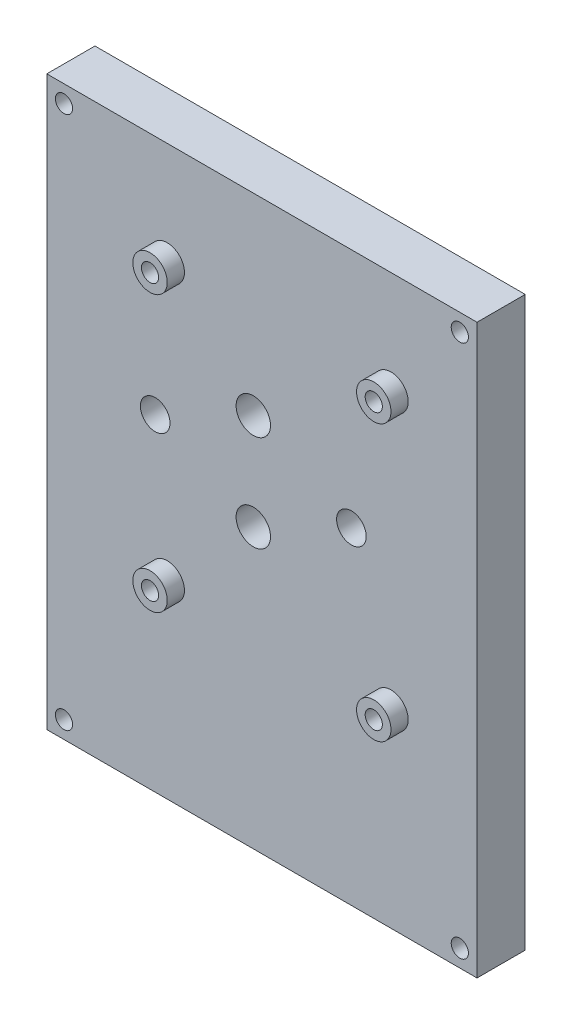
ISO-10303-21;
HEADER;
FILE_DESCRIPTION(('STEP AP214'),'2;1');
FILE_NAME('part.step','',(''),(''),'','','');
FILE_SCHEMA(('AUTOMOTIVE_DESIGN { 1 0 10303 214 1 1 1 1 }'));
ENDSEC;
DATA;
#1=APPLICATION_CONTEXT('core data for automotive mechanical design processes');
#2=APPLICATION_PROTOCOL_DEFINITION('international standard','automotive_design',2000,#1);
#3=PRODUCT_CONTEXT('',#1,'mechanical');
#4=PRODUCT('Part','Part','',(#3));
#5=PRODUCT_RELATED_PRODUCT_CATEGORY('part','',(#4));
#6=PRODUCT_DEFINITION_FORMATION('','',#4);
#7=PRODUCT_DEFINITION_CONTEXT('part definition',#1,'design');
#8=PRODUCT_DEFINITION('design','',#6,#7);
#9=PRODUCT_DEFINITION_SHAPE('','',#8);
#10=(LENGTH_UNIT() NAMED_UNIT(*) SI_UNIT(.MILLI.,.METRE.));
#11=(NAMED_UNIT(*) PLANE_ANGLE_UNIT() SI_UNIT($,.RADIAN.));
#12=(NAMED_UNIT(*) SI_UNIT($,.STERADIAN.) SOLID_ANGLE_UNIT());
#13=UNCERTAINTY_MEASURE_WITH_UNIT(LENGTH_MEASURE(1.E-05),#10,'distance_accuracy_value','');
#14=(GEOMETRIC_REPRESENTATION_CONTEXT(3) GLOBAL_UNCERTAINTY_ASSIGNED_CONTEXT((#13)) GLOBAL_UNIT_ASSIGNED_CONTEXT((#10,
#11,#12)) REPRESENTATION_CONTEXT('',''));
#15=CARTESIAN_POINT('',(0.,0.,0.));
#16=DIRECTION('',(0.,0.,1.));
#17=DIRECTION('',(1.,0.,0.));
#18=AXIS2_PLACEMENT_3D('',#15,#16,#17);
#19=CARTESIAN_POINT('',(0.,-7.,7.));
#20=DIRECTION('',(0.,0.,-1.));
#21=DIRECTION('',(-1.,0.,0.));
#22=AXIS2_PLACEMENT_3D('',#19,#20,#21);
#23=CYLINDRICAL_SURFACE('',#22,2.5);
#24=CARTESIAN_POINT('',(0.,-7.,7.));
#25=DIRECTION('',(0.,0.,1.));
#26=DIRECTION('',(1.,0.,0.));
#27=AXIS2_PLACEMENT_3D('',#24,#25,#26);
#28=CIRCLE('',#27,2.5);
#29=CARTESIAN_POINT('',(2.5,-7.,7.));
#30=VERTEX_POINT('',#29);
#31=EDGE_CURVE('E145',#30,#30,#28,.T.);
#32=ORIENTED_EDGE('',*,*,#31,.T.);
#33=EDGE_LOOP('',(#32));
#34=FACE_BOUND('',#33,.T.);
#35=CARTESIAN_POINT('',(0.,-7.,0.));
#36=DIRECTION('',(0.,0.,1.));
#37=DIRECTION('',(1.,0.,0.));
#38=AXIS2_PLACEMENT_3D('',#35,#36,#37);
#39=CIRCLE('',#38,2.5);
#40=CARTESIAN_POINT('',(2.5,-7.,0.));
#41=VERTEX_POINT('',#40);
#42=EDGE_CURVE('E272',#41,#41,#39,.T.);
#43=ORIENTED_EDGE('',*,*,#42,.F.);
#44=EDGE_LOOP('',(#43));
#45=FACE_BOUND('',#44,.T.);
#46=ADVANCED_FACE('F136',(#34,#45),#23,.F.);
#47=CARTESIAN_POINT('',(0.,7.,7.));
#48=DIRECTION('',(0.,0.,-1.));
#49=DIRECTION('',(-1.,0.,0.));
#50=AXIS2_PLACEMENT_3D('',#47,#48,#49);
#51=CYLINDRICAL_SURFACE('',#50,2.5);
#52=CARTESIAN_POINT('',(0.,7.,7.));
#53=DIRECTION('',(0.,0.,1.));
#54=DIRECTION('',(1.,0.,0.));
#55=AXIS2_PLACEMENT_3D('',#52,#53,#54);
#56=CIRCLE('',#55,2.5);
#57=CARTESIAN_POINT('',(2.5,7.,7.));
#58=VERTEX_POINT('',#57);
#59=EDGE_CURVE('E12',#58,#58,#56,.T.);
#60=ORIENTED_EDGE('',*,*,#59,.T.);
#61=EDGE_LOOP('',(#60));
#62=FACE_BOUND('',#61,.T.);
#63=CARTESIAN_POINT('',(0.,7.,0.));
#64=DIRECTION('',(0.,0.,1.));
#65=DIRECTION('',(1.,0.,0.));
#66=AXIS2_PLACEMENT_3D('',#63,#64,#65);
#67=CIRCLE('',#66,2.5);
#68=CARTESIAN_POINT('',(2.5,7.,0.));
#69=VERTEX_POINT('',#68);
#70=EDGE_CURVE('E139',#69,#69,#67,.T.);
#71=ORIENTED_EDGE('',*,*,#70,.F.);
#72=EDGE_LOOP('',(#71));
#73=FACE_BOUND('',#72,.T.);
#74=ADVANCED_FACE('F284',(#62,#73),#51,.F.);
#75=CARTESIAN_POINT('',(0.,0.,7.));
#76=DIRECTION('',(0.,0.,1.));
#77=DIRECTION('',(1.,0.,0.));
#78=AXIS2_PLACEMENT_3D('',#75,#76,#77);
#79=PLANE('',#78);
#80=CARTESIAN_POINT('',(-27.5,-45.,7.));
#81=DIRECTION('',(0.,0.,1.));
#82=DIRECTION('',(1.,0.,0.));
#83=AXIS2_PLACEMENT_3D('',#80,#81,#82);
#84=CIRCLE('',#83,1.25);
#85=CARTESIAN_POINT('',(-26.25,-45.,7.));
#86=VERTEX_POINT('',#85);
#87=EDGE_CURVE('E400',#86,#86,#84,.T.);
#88=ORIENTED_EDGE('',*,*,#87,.F.);
#89=EDGE_LOOP('',(#88));
#90=FACE_BOUND('',#89,.T.);
#91=CARTESIAN_POINT('',(30.,-45.,7.));
#92=DIRECTION('',(0.,0.,1.));
#93=DIRECTION('',(1.,0.,0.));
#94=AXIS2_PLACEMENT_3D('',#91,#92,#93);
#95=CIRCLE('',#94,1.25);
#96=CARTESIAN_POINT('',(31.25,-45.,7.));
#97=VERTEX_POINT('',#96);
#98=EDGE_CURVE('E394',#97,#97,#95,.T.);
#99=ORIENTED_EDGE('',*,*,#98,.F.);
#100=EDGE_LOOP('',(#99));
#101=FACE_BOUND('',#100,.T.);
#102=CARTESIAN_POINT('',(30.,32.5,7.));
#103=DIRECTION('',(0.,0.,1.));
#104=DIRECTION('',(1.,0.,0.));
#105=AXIS2_PLACEMENT_3D('',#102,#103,#104);
#106=CIRCLE('',#105,1.25);
#107=CARTESIAN_POINT('',(31.25,32.5,7.));
#108=VERTEX_POINT('',#107);
#109=EDGE_CURVE('E389',#108,#108,#106,.T.);
#110=ORIENTED_EDGE('',*,*,#109,.F.);
#111=EDGE_LOOP('',(#110));
#112=FACE_BOUND('',#111,.T.);
#113=CARTESIAN_POINT('',(-27.5,32.5,7.));
#114=DIRECTION('',(0.,0.,1.));
#115=DIRECTION('',(1.,0.,0.));
#116=AXIS2_PLACEMENT_3D('',#113,#114,#115);
#117=CIRCLE('',#116,1.25);
#118=CARTESIAN_POINT('',(-26.25,32.5,7.));
#119=VERTEX_POINT('',#118);
#120=EDGE_CURVE('E200',#119,#119,#117,.T.);
#121=ORIENTED_EDGE('',*,*,#120,.F.);
#122=EDGE_LOOP('',(#121));
#123=FACE_BOUND('',#122,.T.);
#124=CARTESIAN_POINT('',(-14.25,0.,7.));
#125=DIRECTION('',(0.,0.,1.));
#126=DIRECTION('',(1.,0.,0.));
#127=AXIS2_PLACEMENT_3D('',#124,#125,#126);
#128=CIRCLE('',#127,2.15);
#129=CARTESIAN_POINT('',(-12.1,0.,7.));
#130=VERTEX_POINT('',#129);
#131=EDGE_CURVE('E213',#130,#130,#128,.T.);
#132=ORIENTED_EDGE('',*,*,#131,.F.);
#133=EDGE_LOOP('',(#132));
#134=FACE_BOUND('',#133,.T.);
#135=CARTESIAN_POINT('',(14.25,0.,7.));
#136=DIRECTION('',(0.,0.,1.));
#137=DIRECTION('',(1.,0.,0.));
#138=AXIS2_PLACEMENT_3D('',#135,#136,#137);
#139=CIRCLE('',#138,2.15);
#140=CARTESIAN_POINT('',(16.4,0.,7.));
#141=VERTEX_POINT('',#140);
#142=EDGE_CURVE('E217',#141,#141,#139,.T.);
#143=ORIENTED_EDGE('',*,*,#142,.F.);
#144=EDGE_LOOP('',(#143));
#145=FACE_BOUND('',#144,.T.);
#146=CARTESIAN_POINT('',(20.,-20.,7.));
#147=DIRECTION('',(0.,0.,1.));
#148=DIRECTION('',(1.,0.,0.));
#149=AXIS2_PLACEMENT_3D('',#146,#147,#148);
#150=CIRCLE('',#149,2.5);
#151=CARTESIAN_POINT('',(22.5,-20.,7.));
#152=VERTEX_POINT('',#151);
#153=EDGE_CURVE('E239',#152,#152,#150,.T.);
#154=ORIENTED_EDGE('',*,*,#153,.F.);
#155=EDGE_LOOP('',(#154));
#156=FACE_BOUND('',#155,.T.);
#157=CARTESIAN_POINT('',(-12.5,-20.,7.));
#158=DIRECTION('',(0.,0.,1.));
#159=DIRECTION('',(1.,0.,0.));
#160=AXIS2_PLACEMENT_3D('',#157,#158,#159);
#161=CIRCLE('',#160,2.5);
#162=CARTESIAN_POINT('',(-10.,-20.,7.));
#163=VERTEX_POINT('',#162);
#164=EDGE_CURVE('E248',#163,#163,#161,.T.);
#165=ORIENTED_EDGE('',*,*,#164,.F.);
#166=EDGE_LOOP('',(#165));
#167=FACE_BOUND('',#166,.T.);
#168=CARTESIAN_POINT('',(20.,20.,7.));
#169=DIRECTION('',(0.,0.,1.));
#170=DIRECTION('',(1.,0.,0.));
#171=AXIS2_PLACEMENT_3D('',#168,#169,#170);
#172=CIRCLE('',#171,2.5);
#173=CARTESIAN_POINT('',(22.5,20.,7.));
#174=VERTEX_POINT('',#173);
#175=EDGE_CURVE('E257',#174,#174,#172,.T.);
#176=ORIENTED_EDGE('',*,*,#175,.F.);
#177=EDGE_LOOP('',(#176));
#178=FACE_BOUND('',#177,.T.);
#179=CARTESIAN_POINT('',(-12.5,20.,7.));
#180=DIRECTION('',(0.,0.,1.));
#181=DIRECTION('',(1.,0.,0.));
#182=AXIS2_PLACEMENT_3D('',#179,#180,#181);
#183=CIRCLE('',#182,2.5);
#184=CARTESIAN_POINT('',(-10.,20.,7.));
#185=VERTEX_POINT('',#184);
#186=EDGE_CURVE('E260',#185,#185,#183,.T.);
#187=ORIENTED_EDGE('',*,*,#186,.F.);
#188=EDGE_LOOP('',(#187));
#189=FACE_BOUND('',#188,.T.);
#190=ORIENTED_EDGE('',*,*,#31,.F.);
#191=EDGE_LOOP('',(#190));
#192=FACE_BOUND('',#191,.T.);
#193=ORIENTED_EDGE('',*,*,#59,.F.);
#194=EDGE_LOOP('',(#193));
#195=FACE_BOUND('',#194,.T.);
#196=DIRECTION('',(0.,-1.,0.));
#197=VECTOR('',#196,1.);
#198=CARTESIAN_POINT('',(-30.,-47.5,7.));
#199=LINE('',#198,#197);
#200=CARTESIAN_POINT('',(-30.,35.,7.));
#201=VERTEX_POINT('',#200);
#202=CARTESIAN_POINT('',(-30.,-47.5,7.));
#203=VERTEX_POINT('',#202);
#204=EDGE_CURVE('E179',#201,#203,#199,.T.);
#205=ORIENTED_EDGE('',*,*,#204,.T.);
#206=DIRECTION('',(1.,0.,0.));
#207=VECTOR('',#206,1.);
#208=CARTESIAN_POINT('',(-30.,-47.5,7.));
#209=LINE('',#208,#207);
#210=CARTESIAN_POINT('',(32.5,-47.5,7.));
#211=VERTEX_POINT('',#210);
#212=EDGE_CURVE('E187',#203,#211,#209,.T.);
#213=ORIENTED_EDGE('',*,*,#212,.T.);
#214=DIRECTION('',(0.,1.,0.));
#215=VECTOR('',#214,1.);
#216=CARTESIAN_POINT('',(32.5,-47.5,7.));
#217=LINE('',#216,#215);
#218=CARTESIAN_POINT('',(32.5,35.,7.));
#219=VERTEX_POINT('',#218);
#220=EDGE_CURVE('E193',#211,#219,#217,.T.);
#221=ORIENTED_EDGE('',*,*,#220,.T.);
#222=DIRECTION('',(-1.,0.,0.));
#223=VECTOR('',#222,1.);
#224=CARTESIAN_POINT('',(-30.,35.,7.));
#225=LINE('',#224,#223);
#226=EDGE_CURVE('E184',#219,#201,#225,.T.);
#227=ORIENTED_EDGE('',*,*,#226,.T.);
#228=EDGE_LOOP('',(#205,#213,#221,#227));
#229=FACE_BOUND('',#228,.T.);
#230=ADVANCED_FACE('F195',(#90,#101,#112,#123,#134,#145,#156,#167,#178,#189,#192,#195,#229),#79,.T.);
#231=CARTESIAN_POINT('',(0.,0.,0.));
#232=DIRECTION('',(0.,0.,1.));
#233=DIRECTION('',(1.,0.,0.));
#234=AXIS2_PLACEMENT_3D('',#231,#232,#233);
#235=PLANE('',#234);
#236=CARTESIAN_POINT('',(-27.5,-45.,0.));
#237=DIRECTION('',(0.,0.,1.));
#238=DIRECTION('',(1.,0.,0.));
#239=AXIS2_PLACEMENT_3D('',#236,#237,#238);
#240=CIRCLE('',#239,1.25);
#241=CARTESIAN_POINT('',(-26.25,-45.,0.));
#242=VERTEX_POINT('',#241);
#243=EDGE_CURVE('E403',#242,#242,#240,.F.);
#244=ORIENTED_EDGE('',*,*,#243,.F.);
#245=EDGE_LOOP('',(#244));
#246=FACE_BOUND('',#245,.T.);
#247=CARTESIAN_POINT('',(30.,-45.,0.));
#248=DIRECTION('',(0.,0.,1.));
#249=DIRECTION('',(1.,0.,0.));
#250=AXIS2_PLACEMENT_3D('',#247,#248,#249);
#251=CIRCLE('',#250,1.25);
#252=CARTESIAN_POINT('',(31.25,-45.,0.));
#253=VERTEX_POINT('',#252);
#254=EDGE_CURVE('E397',#253,#253,#251,.F.);
#255=ORIENTED_EDGE('',*,*,#254,.F.);
#256=EDGE_LOOP('',(#255));
#257=FACE_BOUND('',#256,.T.);
#258=CARTESIAN_POINT('',(30.,32.5,0.));
#259=DIRECTION('',(0.,0.,1.));
#260=DIRECTION('',(1.,0.,0.));
#261=AXIS2_PLACEMENT_3D('',#258,#259,#260);
#262=CIRCLE('',#261,1.25);
#263=CARTESIAN_POINT('',(31.25,32.5,0.));
#264=VERTEX_POINT('',#263);
#265=EDGE_CURVE('E386',#264,#264,#262,.F.);
#266=ORIENTED_EDGE('',*,*,#265,.F.);
#267=EDGE_LOOP('',(#266));
#268=FACE_BOUND('',#267,.T.);
#269=CARTESIAN_POINT('',(-27.5,32.5,0.));
#270=DIRECTION('',(0.,0.,1.));
#271=DIRECTION('',(1.,0.,0.));
#272=AXIS2_PLACEMENT_3D('',#269,#270,#271);
#273=CIRCLE('',#272,1.25);
#274=CARTESIAN_POINT('',(-26.25,32.5,0.));
#275=VERTEX_POINT('',#274);
#276=EDGE_CURVE('E197',#275,#275,#273,.F.);
#277=ORIENTED_EDGE('',*,*,#276,.F.);
#278=EDGE_LOOP('',(#277));
#279=FACE_BOUND('',#278,.T.);
#280=CARTESIAN_POINT('',(-12.5,20.,0.));
#281=DIRECTION('',(0.,0.,1.));
#282=DIRECTION('',(1.,0.,0.));
#283=AXIS2_PLACEMENT_3D('',#280,#281,#282);
#284=CIRCLE('',#283,1.25);
#285=CARTESIAN_POINT('',(-11.25,20.,0.));
#286=VERTEX_POINT('',#285);
#287=EDGE_CURVE('E226',#286,#286,#284,.F.);
#288=ORIENTED_EDGE('',*,*,#287,.F.);
#289=EDGE_LOOP('',(#288));
#290=FACE_BOUND('',#289,.T.);
#291=CARTESIAN_POINT('',(20.,-20.,0.));
#292=DIRECTION('',(0.,0.,1.));
#293=DIRECTION('',(1.,0.,0.));
#294=AXIS2_PLACEMENT_3D('',#291,#292,#293);
#295=CIRCLE('',#294,1.25);
#296=CARTESIAN_POINT('',(21.25,-20.,0.));
#297=VERTEX_POINT('',#296);
#298=EDGE_CURVE('E231',#297,#297,#295,.F.);
#299=ORIENTED_EDGE('',*,*,#298,.F.);
#300=EDGE_LOOP('',(#299));
#301=FACE_BOUND('',#300,.T.);
#302=CARTESIAN_POINT('',(20.,20.,0.));
#303=DIRECTION('',(0.,0.,1.));
#304=DIRECTION('',(1.,0.,0.));
#305=AXIS2_PLACEMENT_3D('',#302,#303,#304);
#306=CIRCLE('',#305,1.25);
#307=CARTESIAN_POINT('',(21.25,20.,0.));
#308=VERTEX_POINT('',#307);
#309=EDGE_CURVE('E227',#308,#308,#306,.F.);
#310=ORIENTED_EDGE('',*,*,#309,.F.);
#311=EDGE_LOOP('',(#310));
#312=FACE_BOUND('',#311,.T.);
#313=CARTESIAN_POINT('',(-12.5,-20.,0.));
#314=DIRECTION('',(0.,0.,1.));
#315=DIRECTION('',(1.,0.,0.));
#316=AXIS2_PLACEMENT_3D('',#313,#314,#315);
#317=CIRCLE('',#316,1.25);
#318=CARTESIAN_POINT('',(-11.25,-20.,0.));
#319=VERTEX_POINT('',#318);
#320=EDGE_CURVE('E230',#319,#319,#317,.F.);
#321=ORIENTED_EDGE('',*,*,#320,.F.);
#322=EDGE_LOOP('',(#321));
#323=FACE_BOUND('',#322,.T.);
#324=CARTESIAN_POINT('',(14.25,0.,0.));
#325=DIRECTION('',(0.,0.,1.));
#326=DIRECTION('',(1.,0.,0.));
#327=AXIS2_PLACEMENT_3D('',#324,#325,#326);
#328=CIRCLE('',#327,2.15);
#329=CARTESIAN_POINT('',(16.4,0.,0.));
#330=VERTEX_POINT('',#329);
#331=EDGE_CURVE('E216',#330,#330,#328,.T.);
#332=ORIENTED_EDGE('',*,*,#331,.T.);
#333=EDGE_LOOP('',(#332));
#334=FACE_BOUND('',#333,.T.);
#335=CARTESIAN_POINT('',(-14.25,0.,0.));
#336=DIRECTION('',(0.,0.,1.));
#337=DIRECTION('',(1.,0.,0.));
#338=AXIS2_PLACEMENT_3D('',#335,#336,#337);
#339=CIRCLE('',#338,2.15);
#340=CARTESIAN_POINT('',(-12.1,0.,0.));
#341=VERTEX_POINT('',#340);
#342=EDGE_CURVE('E223',#341,#341,#339,.T.);
#343=ORIENTED_EDGE('',*,*,#342,.T.);
#344=EDGE_LOOP('',(#343));
#345=FACE_BOUND('',#344,.T.);
#346=ORIENTED_EDGE('',*,*,#42,.T.);
#347=EDGE_LOOP('',(#346));
#348=FACE_BOUND('',#347,.T.);
#349=ORIENTED_EDGE('',*,*,#70,.T.);
#350=EDGE_LOOP('',(#349));
#351=FACE_BOUND('',#350,.T.);
#352=DIRECTION('',(0.,1.,0.));
#353=VECTOR('',#352,1.);
#354=CARTESIAN_POINT('',(-30.,-47.5,0.));
#355=LINE('',#354,#353);
#356=CARTESIAN_POINT('',(-30.,-47.5,0.));
#357=VERTEX_POINT('',#356);
#358=CARTESIAN_POINT('',(-30.,35.,0.));
#359=VERTEX_POINT('',#358);
#360=EDGE_CURVE('E154',#357,#359,#355,.T.);
#361=ORIENTED_EDGE('',*,*,#360,.T.);
#362=DIRECTION('',(1.,0.,0.));
#363=VECTOR('',#362,1.);
#364=CARTESIAN_POINT('',(-30.,35.,0.));
#365=LINE('',#364,#363);
#366=CARTESIAN_POINT('',(32.5,35.,0.));
#367=VERTEX_POINT('',#366);
#368=EDGE_CURVE('E409',#359,#367,#365,.T.);
#369=ORIENTED_EDGE('',*,*,#368,.T.);
#370=DIRECTION('',(0.,-1.,0.));
#371=VECTOR('',#370,1.);
#372=CARTESIAN_POINT('',(32.5,-47.5,0.));
#373=LINE('',#372,#371);
#374=CARTESIAN_POINT('',(32.5,-47.5,0.));
#375=VERTEX_POINT('',#374);
#376=EDGE_CURVE('E209',#367,#375,#373,.T.);
#377=ORIENTED_EDGE('',*,*,#376,.T.);
#378=DIRECTION('',(-1.,0.,0.));
#379=VECTOR('',#378,1.);
#380=CARTESIAN_POINT('',(-30.,-47.5,0.));
#381=LINE('',#380,#379);
#382=EDGE_CURVE('E220',#375,#357,#381,.T.);
#383=ORIENTED_EDGE('',*,*,#382,.T.);
#384=EDGE_LOOP('',(#361,#369,#377,#383));
#385=FACE_BOUND('',#384,.T.);
#386=ADVANCED_FACE('F282',(#246,#257,#268,#279,#290,#301,#312,#323,#334,#345,#348,#351,#385),
#235,.F.);
#387=CARTESIAN_POINT('',(-12.5,20.,9.5));
#388=DIRECTION('',(0.,0.,-1.));
#389=DIRECTION('',(-1.,0.,0.));
#390=AXIS2_PLACEMENT_3D('',#387,#388,#389);
#391=CYLINDRICAL_SURFACE('',#390,1.25);
#392=CARTESIAN_POINT('',(-12.5,20.,9.5));
#393=DIRECTION('',(0.,0.,1.));
#394=DIRECTION('',(1.,0.,0.));
#395=AXIS2_PLACEMENT_3D('',#392,#393,#394);
#396=CIRCLE('',#395,1.25);
#397=CARTESIAN_POINT('',(-11.25,20.,9.5));
#398=VERTEX_POINT('',#397);
#399=EDGE_CURVE('E266',#398,#398,#396,.T.);
#400=ORIENTED_EDGE('',*,*,#399,.T.);
#401=EDGE_LOOP('',(#400));
#402=FACE_BOUND('',#401,.T.);
#403=ORIENTED_EDGE('',*,*,#287,.T.);
#404=EDGE_LOOP('',(#403));
#405=FACE_BOUND('',#404,.T.);
#406=ADVANCED_FACE('F297',(#402,#405),#391,.F.);
#407=CARTESIAN_POINT('',(-12.5,20.,9.5));
#408=DIRECTION('',(0.,0.,-1.));
#409=DIRECTION('',(-1.,0.,0.));
#410=AXIS2_PLACEMENT_3D('',#407,#408,#409);
#411=CYLINDRICAL_SURFACE('',#410,2.5);
#412=CARTESIAN_POINT('',(-12.5,20.,9.5));
#413=DIRECTION('',(0.,0.,1.));
#414=DIRECTION('',(1.,0.,0.));
#415=AXIS2_PLACEMENT_3D('',#412,#413,#414);
#416=CIRCLE('',#415,2.5);
#417=CARTESIAN_POINT('',(-10.,20.,9.5));
#418=VERTEX_POINT('',#417);
#419=EDGE_CURVE('E269',#418,#418,#416,.T.);
#420=ORIENTED_EDGE('',*,*,#419,.F.);
#421=EDGE_LOOP('',(#420));
#422=FACE_BOUND('',#421,.T.);
#423=ORIENTED_EDGE('',*,*,#186,.T.);
#424=EDGE_LOOP('',(#423));
#425=FACE_BOUND('',#424,.T.);
#426=ADVANCED_FACE('F301',(#422,#425),#411,.T.);
#427=CARTESIAN_POINT('',(0.,0.,9.5));
#428=DIRECTION('',(0.,0.,1.));
#429=DIRECTION('',(1.,0.,0.));
#430=AXIS2_PLACEMENT_3D('',#427,#428,#429);
#431=PLANE('',#430);
#432=ORIENTED_EDGE('',*,*,#399,.F.);
#433=EDGE_LOOP('',(#432));
#434=FACE_BOUND('',#433,.T.);
#435=ORIENTED_EDGE('',*,*,#419,.T.);
#436=EDGE_LOOP('',(#435));
#437=FACE_BOUND('',#436,.T.);
#438=ADVANCED_FACE('F305',(#434,#437),#431,.T.);
#439=CARTESIAN_POINT('',(20.,20.,9.5));
#440=DIRECTION('',(0.,0.,-1.));
#441=DIRECTION('',(-1.,0.,0.));
#442=AXIS2_PLACEMENT_3D('',#439,#440,#441);
#443=CYLINDRICAL_SURFACE('',#442,1.25);
#444=CARTESIAN_POINT('',(20.,20.,9.5));
#445=DIRECTION('',(0.,0.,1.));
#446=DIRECTION('',(1.,0.,0.));
#447=AXIS2_PLACEMENT_3D('',#444,#445,#446);
#448=CIRCLE('',#447,1.25);
#449=CARTESIAN_POINT('',(21.25,20.,9.5));
#450=VERTEX_POINT('',#449);
#451=EDGE_CURVE('E261',#450,#450,#448,.T.);
#452=ORIENTED_EDGE('',*,*,#451,.T.);
#453=EDGE_LOOP('',(#452));
#454=FACE_BOUND('',#453,.T.);
#455=ORIENTED_EDGE('',*,*,#309,.T.);
#456=EDGE_LOOP('',(#455));
#457=FACE_BOUND('',#456,.T.);
#458=ADVANCED_FACE('F309',(#454,#457),#443,.F.);
#459=CARTESIAN_POINT('',(20.,20.,9.5));
#460=DIRECTION('',(0.,0.,-1.));
#461=DIRECTION('',(-1.,0.,0.));
#462=AXIS2_PLACEMENT_3D('',#459,#460,#461);
#463=CYLINDRICAL_SURFACE('',#462,2.5);
#464=CARTESIAN_POINT('',(20.,20.,9.5));
#465=DIRECTION('',(0.,0.,1.));
#466=DIRECTION('',(1.,0.,0.));
#467=AXIS2_PLACEMENT_3D('',#464,#465,#466);
#468=CIRCLE('',#467,2.5);
#469=CARTESIAN_POINT('',(22.5,20.,9.5));
#470=VERTEX_POINT('',#469);
#471=EDGE_CURVE('E256',#470,#470,#468,.T.);
#472=ORIENTED_EDGE('',*,*,#471,.F.);
#473=EDGE_LOOP('',(#472));
#474=FACE_BOUND('',#473,.T.);
#475=ORIENTED_EDGE('',*,*,#175,.T.);
#476=EDGE_LOOP('',(#475));
#477=FACE_BOUND('',#476,.T.);
#478=ADVANCED_FACE('F315',(#474,#477),#463,.T.);
#479=CARTESIAN_POINT('',(0.,0.,9.5));
#480=DIRECTION('',(0.,0.,1.));
#481=DIRECTION('',(1.,0.,0.));
#482=AXIS2_PLACEMENT_3D('',#479,#480,#481);
#483=PLANE('',#482);
#484=ORIENTED_EDGE('',*,*,#451,.F.);
#485=EDGE_LOOP('',(#484));
#486=FACE_BOUND('',#485,.T.);
#487=ORIENTED_EDGE('',*,*,#471,.T.);
#488=EDGE_LOOP('',(#487));
#489=FACE_BOUND('',#488,.T.);
#490=ADVANCED_FACE('F311',(#486,#489),#483,.T.);
#491=CARTESIAN_POINT('',(-12.5,-20.,9.5));
#492=DIRECTION('',(0.,0.,1.));
#493=DIRECTION('',(1.,0.,0.));
#494=AXIS2_PLACEMENT_3D('',#491,#492,#493);
#495=PLANE('',#494);
#496=CARTESIAN_POINT('',(-12.5,-20.,9.5));
#497=DIRECTION('',(0.,0.,1.));
#498=DIRECTION('',(1.,0.,0.));
#499=AXIS2_PLACEMENT_3D('',#496,#497,#498);
#500=CIRCLE('',#499,2.5);
#501=CARTESIAN_POINT('',(-10.,-20.,9.5));
#502=VERTEX_POINT('',#501);
#503=EDGE_CURVE('E247',#502,#502,#500,.T.);
#504=ORIENTED_EDGE('',*,*,#503,.T.);
#505=EDGE_LOOP('',(#504));
#506=FACE_BOUND('',#505,.T.);
#507=CARTESIAN_POINT('',(-12.5,-20.,9.5));
#508=DIRECTION('',(0.,0.,1.));
#509=DIRECTION('',(1.,0.,0.));
#510=AXIS2_PLACEMENT_3D('',#507,#508,#509);
#511=CIRCLE('',#510,1.25);
#512=CARTESIAN_POINT('',(-11.25,-20.,9.5));
#513=VERTEX_POINT('',#512);
#514=EDGE_CURVE('E251',#513,#513,#511,.T.);
#515=ORIENTED_EDGE('',*,*,#514,.F.);
#516=EDGE_LOOP('',(#515));
#517=FACE_BOUND('',#516,.T.);
#518=ADVANCED_FACE('F314',(#506,#517),#495,.T.);
#519=CARTESIAN_POINT('',(-12.5,-20.,9.5));
#520=DIRECTION('',(0.,0.,-1.));
#521=DIRECTION('',(-1.,0.,0.));
#522=AXIS2_PLACEMENT_3D('',#519,#520,#521);
#523=CYLINDRICAL_SURFACE('',#522,2.5);
#524=ORIENTED_EDGE('',*,*,#503,.F.);
#525=EDGE_LOOP('',(#524));
#526=FACE_BOUND('',#525,.T.);
#527=ORIENTED_EDGE('',*,*,#164,.T.);
#528=EDGE_LOOP('',(#527));
#529=FACE_BOUND('',#528,.T.);
#530=ADVANCED_FACE('F327',(#526,#529),#523,.T.);
#531=CARTESIAN_POINT('',(-12.5,-20.,9.5));
#532=DIRECTION('',(0.,0.,-1.));
#533=DIRECTION('',(-1.,0.,0.));
#534=AXIS2_PLACEMENT_3D('',#531,#532,#533);
#535=CYLINDRICAL_SURFACE('',#534,1.25);
#536=ORIENTED_EDGE('',*,*,#514,.T.);
#537=EDGE_LOOP('',(#536));
#538=FACE_BOUND('',#537,.T.);
#539=ORIENTED_EDGE('',*,*,#320,.T.);
#540=EDGE_LOOP('',(#539));
#541=FACE_BOUND('',#540,.T.);
#542=ADVANCED_FACE('F323',(#538,#541),#535,.F.);
#543=CARTESIAN_POINT('',(20.,-20.,9.5));
#544=DIRECTION('',(0.,0.,1.));
#545=DIRECTION('',(1.,0.,0.));
#546=AXIS2_PLACEMENT_3D('',#543,#544,#545);
#547=PLANE('',#546);
#548=CARTESIAN_POINT('',(20.,-20.,9.5));
#549=DIRECTION('',(0.,0.,1.));
#550=DIRECTION('',(1.,0.,0.));
#551=AXIS2_PLACEMENT_3D('',#548,#549,#550);
#552=CIRCLE('',#551,2.5);
#553=CARTESIAN_POINT('',(22.5,-20.,9.5));
#554=VERTEX_POINT('',#553);
#555=EDGE_CURVE('E238',#554,#554,#552,.T.);
#556=ORIENTED_EDGE('',*,*,#555,.T.);
#557=EDGE_LOOP('',(#556));
#558=FACE_BOUND('',#557,.T.);
#559=CARTESIAN_POINT('',(20.,-20.,9.5));
#560=DIRECTION('',(0.,0.,1.));
#561=DIRECTION('',(1.,0.,0.));
#562=AXIS2_PLACEMENT_3D('',#559,#560,#561);
#563=CIRCLE('',#562,1.25);
#564=CARTESIAN_POINT('',(21.25,-20.,9.5));
#565=VERTEX_POINT('',#564);
#566=EDGE_CURVE('E242',#565,#565,#563,.T.);
#567=ORIENTED_EDGE('',*,*,#566,.F.);
#568=EDGE_LOOP('',(#567));
#569=FACE_BOUND('',#568,.T.);
#570=ADVANCED_FACE('F326',(#558,#569),#547,.T.);
#571=CARTESIAN_POINT('',(20.,-20.,9.5));
#572=DIRECTION('',(0.,0.,-1.));
#573=DIRECTION('',(-1.,0.,0.));
#574=AXIS2_PLACEMENT_3D('',#571,#572,#573);
#575=CYLINDRICAL_SURFACE('',#574,2.5);
#576=ORIENTED_EDGE('',*,*,#555,.F.);
#577=EDGE_LOOP('',(#576));
#578=FACE_BOUND('',#577,.T.);
#579=ORIENTED_EDGE('',*,*,#153,.T.);
#580=EDGE_LOOP('',(#579));
#581=FACE_BOUND('',#580,.T.);
#582=ADVANCED_FACE('F339',(#578,#581),#575,.T.);
#583=CARTESIAN_POINT('',(20.,-20.,9.5));
#584=DIRECTION('',(0.,0.,-1.));
#585=DIRECTION('',(-1.,0.,0.));
#586=AXIS2_PLACEMENT_3D('',#583,#584,#585);
#587=CYLINDRICAL_SURFACE('',#586,1.25);
#588=ORIENTED_EDGE('',*,*,#566,.T.);
#589=EDGE_LOOP('',(#588));
#590=FACE_BOUND('',#589,.T.);
#591=ORIENTED_EDGE('',*,*,#298,.T.);
#592=EDGE_LOOP('',(#591));
#593=FACE_BOUND('',#592,.T.);
#594=ADVANCED_FACE('F335',(#590,#593),#587,.F.);
#595=CARTESIAN_POINT('',(14.25,0.,-18.0811183182043));
#596=DIRECTION('',(0.,0.,1.));
#597=DIRECTION('',(1.,0.,0.));
#598=AXIS2_PLACEMENT_3D('',#595,#596,#597);
#599=CYLINDRICAL_SURFACE('',#598,2.15);
#600=ORIENTED_EDGE('',*,*,#142,.T.);
#601=EDGE_LOOP('',(#600));
#602=FACE_BOUND('',#601,.T.);
#603=ORIENTED_EDGE('',*,*,#331,.F.);
#604=EDGE_LOOP('',(#603));
#605=FACE_BOUND('',#604,.T.);
#606=ADVANCED_FACE('F338',(#602,#605),#599,.F.);
#607=CARTESIAN_POINT('',(-14.25,0.,-18.0811183182043));
#608=DIRECTION('',(0.,0.,1.));
#609=DIRECTION('',(1.,0.,0.));
#610=AXIS2_PLACEMENT_3D('',#607,#608,#609);
#611=CYLINDRICAL_SURFACE('',#610,2.15);
#612=ORIENTED_EDGE('',*,*,#131,.T.);
#613=EDGE_LOOP('',(#612));
#614=FACE_BOUND('',#613,.T.);
#615=ORIENTED_EDGE('',*,*,#342,.F.);
#616=EDGE_LOOP('',(#615));
#617=FACE_BOUND('',#616,.T.);
#618=ADVANCED_FACE('F349',(#614,#617),#611,.F.);
#619=CARTESIAN_POINT('',(-30.,-47.5,-103.501207722422));
#620=DIRECTION('',(0.,-1.,0.));
#621=DIRECTION('',(0.,0.,-1.));
#622=AXIS2_PLACEMENT_3D('',#619,#620,#621);
#623=PLANE('',#622);
#624=ORIENTED_EDGE('',*,*,#382,.F.);
#625=DIRECTION('',(0.,0.,1.));
#626=VECTOR('',#625,1.);
#627=CARTESIAN_POINT('',(32.5,-47.5,-103.501207722422));
#628=LINE('',#627,#626);
#629=EDGE_CURVE('E183',#375,#211,#628,.T.);
#630=ORIENTED_EDGE('',*,*,#629,.T.);
#631=ORIENTED_EDGE('',*,*,#212,.F.);
#632=DIRECTION('',(0.,0.,1.));
#633=VECTOR('',#632,1.);
#634=CARTESIAN_POINT('',(-30.,-47.5,-103.501207722422));
#635=LINE('',#634,#633);
#636=EDGE_CURVE('E174',#357,#203,#635,.T.);
#637=ORIENTED_EDGE('',*,*,#636,.F.);
#638=EDGE_LOOP('',(#624,#630,#631,#637));
#639=FACE_BOUND('',#638,.T.);
#640=ADVANCED_FACE('F188',(#639),#623,.T.);
#641=CARTESIAN_POINT('',(32.5,-47.5,-103.501207722422));
#642=DIRECTION('',(1.,0.,0.));
#643=DIRECTION('',(0.,0.,-1.));
#644=AXIS2_PLACEMENT_3D('',#641,#642,#643);
#645=PLANE('',#644);
#646=ORIENTED_EDGE('',*,*,#376,.F.);
#647=DIRECTION('',(0.,0.,1.));
#648=VECTOR('',#647,1.);
#649=CARTESIAN_POINT('',(32.5,35.,-103.501207722422));
#650=LINE('',#649,#648);
#651=EDGE_CURVE('E210',#367,#219,#650,.T.);
#652=ORIENTED_EDGE('',*,*,#651,.T.);
#653=ORIENTED_EDGE('',*,*,#220,.F.);
#654=ORIENTED_EDGE('',*,*,#629,.F.);
#655=EDGE_LOOP('',(#646,#652,#653,#654));
#656=FACE_BOUND('',#655,.T.);
#657=ADVANCED_FACE('F360',(#656),#645,.T.);
#658=CARTESIAN_POINT('',(-30.,35.,-103.501207722422));
#659=DIRECTION('',(0.,1.,0.));
#660=DIRECTION('',(0.,0.,1.));
#661=AXIS2_PLACEMENT_3D('',#658,#659,#660);
#662=PLANE('',#661);
#663=ORIENTED_EDGE('',*,*,#368,.F.);
#664=DIRECTION('',(0.,0.,1.));
#665=VECTOR('',#664,1.);
#666=CARTESIAN_POINT('',(-30.,35.,-103.501207722422));
#667=LINE('',#666,#665);
#668=EDGE_CURVE('E207',#359,#201,#667,.T.);
#669=ORIENTED_EDGE('',*,*,#668,.T.);
#670=ORIENTED_EDGE('',*,*,#226,.F.);
#671=ORIENTED_EDGE('',*,*,#651,.F.);
#672=EDGE_LOOP('',(#663,#669,#670,#671));
#673=FACE_BOUND('',#672,.T.);
#674=ADVANCED_FACE('F357',(#673),#662,.T.);
#675=CARTESIAN_POINT('',(-30.,-47.5,-103.501207722422));
#676=DIRECTION('',(-1.,0.,0.));
#677=DIRECTION('',(0.,0.,1.));
#678=AXIS2_PLACEMENT_3D('',#675,#676,#677);
#679=PLANE('',#678);
#680=ORIENTED_EDGE('',*,*,#360,.F.);
#681=ORIENTED_EDGE('',*,*,#636,.T.);
#682=ORIENTED_EDGE('',*,*,#204,.F.);
#683=ORIENTED_EDGE('',*,*,#668,.F.);
#684=EDGE_LOOP('',(#680,#681,#682,#683));
#685=FACE_BOUND('',#684,.T.);
#686=ADVANCED_FACE('F176',(#685),#679,.T.);
#687=CARTESIAN_POINT('',(-27.5,32.5,-3.53553390593274));
#688=DIRECTION('',(0.,0.,1.));
#689=DIRECTION('',(1.,0.,0.));
#690=AXIS2_PLACEMENT_3D('',#687,#688,#689);
#691=CYLINDRICAL_SURFACE('',#690,1.25);
#692=ORIENTED_EDGE('',*,*,#276,.T.);
#693=EDGE_LOOP('',(#692));
#694=FACE_BOUND('',#693,.T.);
#695=ORIENTED_EDGE('',*,*,#120,.T.);
#696=EDGE_LOOP('',(#695));
#697=FACE_BOUND('',#696,.T.);
#698=ADVANCED_FACE('F356',(#694,#697),#691,.F.);
#699=CARTESIAN_POINT('',(30.,32.5,-3.53553390593274));
#700=DIRECTION('',(0.,0.,1.));
#701=DIRECTION('',(1.,0.,0.));
#702=AXIS2_PLACEMENT_3D('',#699,#700,#701);
#703=CYLINDRICAL_SURFACE('',#702,1.25);
#704=ORIENTED_EDGE('',*,*,#265,.T.);
#705=EDGE_LOOP('',(#704));
#706=FACE_BOUND('',#705,.T.);
#707=ORIENTED_EDGE('',*,*,#109,.T.);
#708=EDGE_LOOP('',(#707));
#709=FACE_BOUND('',#708,.T.);
#710=ADVANCED_FACE('F369',(#706,#709),#703,.F.);
#711=CARTESIAN_POINT('',(30.,-45.,-3.53553390593274));
#712=DIRECTION('',(0.,0.,1.));
#713=DIRECTION('',(1.,0.,0.));
#714=AXIS2_PLACEMENT_3D('',#711,#712,#713);
#715=CYLINDRICAL_SURFACE('',#714,1.25);
#716=ORIENTED_EDGE('',*,*,#254,.T.);
#717=EDGE_LOOP('',(#716));
#718=FACE_BOUND('',#717,.T.);
#719=ORIENTED_EDGE('',*,*,#98,.T.);
#720=EDGE_LOOP('',(#719));
#721=FACE_BOUND('',#720,.T.);
#722=ADVANCED_FACE('F374',(#718,#721),#715,.F.);
#723=CARTESIAN_POINT('',(-27.5,-45.,-3.53553390593274));
#724=DIRECTION('',(0.,0.,1.));
#725=DIRECTION('',(1.,0.,0.));
#726=AXIS2_PLACEMENT_3D('',#723,#724,#725);
#727=CYLINDRICAL_SURFACE('',#726,1.25);
#728=ORIENTED_EDGE('',*,*,#243,.T.);
#729=EDGE_LOOP('',(#728));
#730=FACE_BOUND('',#729,.T.);
#731=ORIENTED_EDGE('',*,*,#87,.T.);
#732=EDGE_LOOP('',(#731));
#733=FACE_BOUND('',#732,.T.);
#734=ADVANCED_FACE('F371',(#730,#733),#727,.F.);
#735=CLOSED_SHELL('',(#46,#74,#230,#386,#406,#426,#438,#458,#478,#490,#518,#530,#542,#570,#582,
#594,#606,#618,#640,#657,#674,#686,#698,#710,#722,#734));
#736=MANIFOLD_SOLID_BREP('B2',#735);
#737=ADVANCED_BREP_SHAPE_REPRESENTATION('',(#18,#736),#14);
#738=SHAPE_DEFINITION_REPRESENTATION(#9,#737);
ENDSEC;
END-ISO-10303-21;
